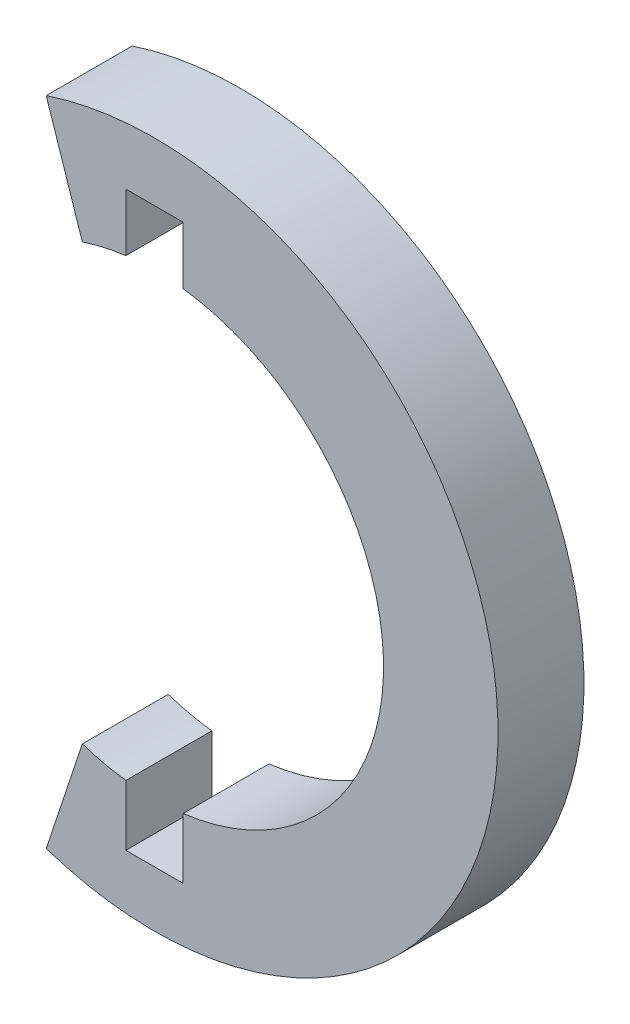
ISO-10303-21;
HEADER;
FILE_DESCRIPTION(('STEP AP214'),'2;1');
FILE_NAME('part.step','',(''),(''),'','','');
FILE_SCHEMA(('AUTOMOTIVE_DESIGN { 1 0 10303 214 1 1 1 1 }'));
ENDSEC;
DATA;
#1=APPLICATION_CONTEXT('core data for automotive mechanical design processes');
#2=APPLICATION_PROTOCOL_DEFINITION('international standard','automotive_design',2000,#1);
#3=PRODUCT_CONTEXT('',#1,'mechanical');
#4=PRODUCT('Part','Part','',(#3));
#5=PRODUCT_RELATED_PRODUCT_CATEGORY('part','',(#4));
#6=PRODUCT_DEFINITION_FORMATION('','',#4);
#7=PRODUCT_DEFINITION_CONTEXT('part definition',#1,'design');
#8=PRODUCT_DEFINITION('design','',#6,#7);
#9=PRODUCT_DEFINITION_SHAPE('','',#8);
#10=(LENGTH_UNIT() NAMED_UNIT(*) SI_UNIT(.MILLI.,.METRE.));
#11=(NAMED_UNIT(*) PLANE_ANGLE_UNIT() SI_UNIT($,.RADIAN.));
#12=(NAMED_UNIT(*) SI_UNIT($,.STERADIAN.) SOLID_ANGLE_UNIT());
#13=UNCERTAINTY_MEASURE_WITH_UNIT(LENGTH_MEASURE(1.E-05),#10,'distance_accuracy_value','');
#14=(GEOMETRIC_REPRESENTATION_CONTEXT(3) GLOBAL_UNCERTAINTY_ASSIGNED_CONTEXT((#13)) GLOBAL_UNIT_ASSIGNED_CONTEXT((#10,
#11,#12)) REPRESENTATION_CONTEXT('',''));
#15=CARTESIAN_POINT('',(0.,0.,0.));
#16=DIRECTION('',(0.,0.,1.));
#17=DIRECTION('',(1.,0.,0.));
#18=AXIS2_PLACEMENT_3D('',#15,#16,#17);
#19=CARTESIAN_POINT('',(0.,0.,3.));
#20=DIRECTION('',(0.,0.,-1.));
#21=DIRECTION('',(-1.,0.,0.));
#22=AXIS2_PLACEMENT_3D('',#19,#20,#21);
#23=CYLINDRICAL_SURFACE('',#22,8.);
#24=CARTESIAN_POINT('',(0.,0.,0.));
#25=DIRECTION('',(0.,0.,-1.));
#26=DIRECTION('',(1.,0.,0.));
#27=AXIS2_PLACEMENT_3D('',#24,#25,#26);
#28=CIRCLE('',#27,8.);
#29=CARTESIAN_POINT('',(1.,7.93725393319377,0.));
#30=VERTEX_POINT('',#29);
#31=CARTESIAN_POINT('',(1.,-7.93725393319377,0.));
#32=VERTEX_POINT('',#31);
#33=EDGE_CURVE('E157',#30,#32,#28,.T.);
#34=ORIENTED_EDGE('',*,*,#33,.T.);
#35=DIRECTION('',(0.,0.,-1.));
#36=VECTOR('',#35,1.);
#37=CARTESIAN_POINT('',(1.,-7.93725393319377,3.));
#38=LINE('',#37,#36);
#39=CARTESIAN_POINT('',(1.,-7.93725393319377,3.));
#40=VERTEX_POINT('',#39);
#41=EDGE_CURVE('E41',#40,#32,#38,.T.);
#42=ORIENTED_EDGE('',*,*,#41,.F.);
#43=CARTESIAN_POINT('',(0.,0.,3.));
#44=DIRECTION('',(0.,0.,-1.));
#45=DIRECTION('',(1.,0.,0.));
#46=AXIS2_PLACEMENT_3D('',#43,#44,#45);
#47=CIRCLE('',#46,8.);
#48=CARTESIAN_POINT('',(1.,7.93725393319377,3.));
#49=VERTEX_POINT('',#48);
#50=EDGE_CURVE('E104',#49,#40,#47,.T.);
#51=ORIENTED_EDGE('',*,*,#50,.F.);
#52=DIRECTION('',(0.,0.,-1.));
#53=VECTOR('',#52,1.);
#54=CARTESIAN_POINT('',(1.,7.93725393319377,3.));
#55=LINE('',#54,#53);
#56=EDGE_CURVE('E11',#49,#30,#55,.T.);
#57=ORIENTED_EDGE('',*,*,#56,.T.);
#58=EDGE_LOOP('',(#34,#42,#51,#57));
#59=FACE_BOUND('',#58,.T.);
#60=ADVANCED_FACE('F33',(#59),#23,.F.);
#61=CARTESIAN_POINT('',(1.,-8.94427190999916,3.));
#62=DIRECTION('',(1.,0.,0.));
#63=DIRECTION('',(0.,1.,0.));
#64=AXIS2_PLACEMENT_3D('',#61,#62,#63);
#65=PLANE('',#64);
#66=DIRECTION('',(0.,-1.,0.));
#67=VECTOR('',#66,1.);
#68=CARTESIAN_POINT('',(1.,-8.94427190999916,0.));
#69=LINE('',#68,#67);
#70=CARTESIAN_POINT('',(0.999999999999999,-10.0501256289338,0.));
#71=VERTEX_POINT('',#70);
#72=EDGE_CURVE('E160',#32,#71,#69,.T.);
#73=ORIENTED_EDGE('',*,*,#72,.T.);
#74=DIRECTION('',(0.,0.,-1.));
#75=VECTOR('',#74,1.);
#76=CARTESIAN_POINT('',(0.999999999999999,-10.0501256289338,3.));
#77=LINE('',#76,#75);
#78=CARTESIAN_POINT('',(0.999999999999999,-10.0501256289338,3.));
#79=VERTEX_POINT('',#78);
#80=EDGE_CURVE('E198',#79,#71,#77,.T.);
#81=ORIENTED_EDGE('',*,*,#80,.F.);
#82=DIRECTION('',(0.,-1.,0.));
#83=VECTOR('',#82,1.);
#84=CARTESIAN_POINT('',(1.,-8.94427190999916,3.));
#85=LINE('',#84,#83);
#86=EDGE_CURVE('E205',#40,#79,#85,.T.);
#87=ORIENTED_EDGE('',*,*,#86,.F.);
#88=ORIENTED_EDGE('',*,*,#41,.T.);
#89=EDGE_LOOP('',(#73,#81,#87,#88));
#90=FACE_BOUND('',#89,.T.);
#91=ADVANCED_FACE('F203',(#90),#65,.F.);
#92=CARTESIAN_POINT('',(0.999999999999999,-10.0501256289338,3.));
#93=DIRECTION('',(0.,-1.,0.));
#94=DIRECTION('',(0.,0.,-1.));
#95=AXIS2_PLACEMENT_3D('',#92,#93,#94);
#96=PLANE('',#95);
#97=DIRECTION('',(-1.,0.,0.));
#98=VECTOR('',#97,1.);
#99=CARTESIAN_POINT('',(0.999999999999999,-10.0501256289338,0.));
#100=LINE('',#99,#98);
#101=CARTESIAN_POINT('',(-0.999999999999999,-10.0501256289338,0.));
#102=VERTEX_POINT('',#101);
#103=EDGE_CURVE('E162',#71,#102,#100,.T.);
#104=ORIENTED_EDGE('',*,*,#103,.T.);
#105=DIRECTION('',(0.,0.,-1.));
#106=VECTOR('',#105,1.);
#107=CARTESIAN_POINT('',(-0.999999999999999,-10.0501256289338,3.));
#108=LINE('',#107,#106);
#109=CARTESIAN_POINT('',(-0.999999999999999,-10.0501256289338,3.));
#110=VERTEX_POINT('',#109);
#111=EDGE_CURVE('E195',#110,#102,#108,.T.);
#112=ORIENTED_EDGE('',*,*,#111,.F.);
#113=DIRECTION('',(-1.,0.,0.));
#114=VECTOR('',#113,1.);
#115=CARTESIAN_POINT('',(0.999999999999999,-10.0501256289338,3.));
#116=LINE('',#115,#114);
#117=EDGE_CURVE('E223',#79,#110,#116,.T.);
#118=ORIENTED_EDGE('',*,*,#117,.F.);
#119=ORIENTED_EDGE('',*,*,#80,.T.);
#120=EDGE_LOOP('',(#104,#112,#118,#119));
#121=FACE_BOUND('',#120,.T.);
#122=ADVANCED_FACE('F214',(#121),#96,.F.);
#123=CARTESIAN_POINT('',(-1.,-8.94427190999916,3.));
#124=DIRECTION('',(-1.,0.,0.));
#125=DIRECTION('',(0.,0.,1.));
#126=AXIS2_PLACEMENT_3D('',#123,#124,#125);
#127=PLANE('',#126);
#128=DIRECTION('',(0.,1.,0.));
#129=VECTOR('',#128,1.);
#130=CARTESIAN_POINT('',(-1.,-8.94427190999916,0.));
#131=LINE('',#130,#129);
#132=CARTESIAN_POINT('',(-1.,-7.93725393319377,0.));
#133=VERTEX_POINT('',#132);
#134=EDGE_CURVE('E165',#102,#133,#131,.T.);
#135=ORIENTED_EDGE('',*,*,#134,.T.);
#136=DIRECTION('',(0.,0.,-1.));
#137=VECTOR('',#136,1.);
#138=CARTESIAN_POINT('',(-1.,-7.93725393319377,3.));
#139=LINE('',#138,#137);
#140=CARTESIAN_POINT('',(-1.,-7.93725393319377,3.));
#141=VERTEX_POINT('',#140);
#142=EDGE_CURVE('E192',#141,#133,#139,.T.);
#143=ORIENTED_EDGE('',*,*,#142,.F.);
#144=DIRECTION('',(0.,1.,0.));
#145=VECTOR('',#144,1.);
#146=CARTESIAN_POINT('',(-1.,-8.94427190999916,3.));
#147=LINE('',#146,#145);
#148=EDGE_CURVE('E220',#110,#141,#147,.T.);
#149=ORIENTED_EDGE('',*,*,#148,.F.);
#150=ORIENTED_EDGE('',*,*,#111,.T.);
#151=EDGE_LOOP('',(#135,#143,#149,#150));
#152=FACE_BOUND('',#151,.T.);
#153=ADVANCED_FACE('F218',(#152),#127,.F.);
#154=CARTESIAN_POINT('',(0.,0.,3.));
#155=DIRECTION('',(0.,0.,-1.));
#156=DIRECTION('',(-1.,0.,0.));
#157=AXIS2_PLACEMENT_3D('',#154,#155,#156);
#158=CYLINDRICAL_SURFACE('',#157,8.);
#159=CARTESIAN_POINT('',(0.,0.,0.));
#160=DIRECTION('',(0.,0.,-1.));
#161=DIRECTION('',(1.,0.,0.));
#162=AXIS2_PLACEMENT_3D('',#159,#160,#161);
#163=CIRCLE('',#162,8.);
#164=CARTESIAN_POINT('',(-2.52114496226176,-7.59235326359767,0.));
#165=VERTEX_POINT('',#164);
#166=EDGE_CURVE('E167',#133,#165,#163,.T.);
#167=ORIENTED_EDGE('',*,*,#166,.T.);
#168=DIRECTION('',(0.,0.,-1.));
#169=VECTOR('',#168,1.);
#170=CARTESIAN_POINT('',(-2.52114496226176,-7.59235326359767,3.));
#171=LINE('',#170,#169);
#172=CARTESIAN_POINT('',(-2.52114496226176,-7.59235326359767,3.));
#173=VERTEX_POINT('',#172);
#174=EDGE_CURVE('E189',#173,#165,#171,.T.);
#175=ORIENTED_EDGE('',*,*,#174,.F.);
#176=CARTESIAN_POINT('',(0.,0.,3.));
#177=DIRECTION('',(0.,0.,-1.));
#178=DIRECTION('',(1.,0.,0.));
#179=AXIS2_PLACEMENT_3D('',#176,#177,#178);
#180=CIRCLE('',#179,8.);
#181=EDGE_CURVE('E222',#141,#173,#180,.T.);
#182=ORIENTED_EDGE('',*,*,#181,.F.);
#183=ORIENTED_EDGE('',*,*,#142,.T.);
#184=EDGE_LOOP('',(#167,#175,#182,#183));
#185=FACE_BOUND('',#184,.T.);
#186=ADVANCED_FACE('F247',(#185),#158,.F.);
#187=CARTESIAN_POINT('',(-2.52114496226176,-7.59235326359767,3.));
#188=DIRECTION('',(0.949044157949708,-0.31514312028272,0.));
#189=DIRECTION('',(0.31514312028272,0.949044157949708,0.));
#190=AXIS2_PLACEMENT_3D('',#187,#188,#189);
#191=PLANE('',#190);
#192=DIRECTION('',(-0.31514312028272,-0.949044157949708,0.));
#193=VECTOR('',#192,1.);
#194=CARTESIAN_POINT('',(-2.52114496226176,-7.59235326359767,0.));
#195=LINE('',#194,#193);
#196=CARTESIAN_POINT('',(-3.78171744339264,-11.3885298953965,0.));
#197=VERTEX_POINT('',#196);
#198=EDGE_CURVE('E169',#165,#197,#195,.T.);
#199=ORIENTED_EDGE('',*,*,#198,.T.);
#200=DIRECTION('',(0.,0.,-1.));
#201=VECTOR('',#200,1.);
#202=CARTESIAN_POINT('',(-3.78171744339264,-11.3885298953965,3.));
#203=LINE('',#202,#201);
#204=CARTESIAN_POINT('',(-3.78171744339264,-11.3885298953965,3.));
#205=VERTEX_POINT('',#204);
#206=EDGE_CURVE('E186',#205,#197,#203,.T.);
#207=ORIENTED_EDGE('',*,*,#206,.F.);
#208=DIRECTION('',(-0.31514312028272,-0.949044157949708,0.));
#209=VECTOR('',#208,1.);
#210=CARTESIAN_POINT('',(-2.52114496226176,-7.59235326359767,3.));
#211=LINE('',#210,#209);
#212=EDGE_CURVE('E225',#173,#205,#211,.T.);
#213=ORIENTED_EDGE('',*,*,#212,.F.);
#214=ORIENTED_EDGE('',*,*,#174,.T.);
#215=EDGE_LOOP('',(#199,#207,#213,#214));
#216=FACE_BOUND('',#215,.T.);
#217=ADVANCED_FACE('F244',(#216),#191,.F.);
#218=CARTESIAN_POINT('',(0.,0.,3.));
#219=DIRECTION('',(0.,0.,-1.));
#220=DIRECTION('',(-1.,0.,0.));
#221=AXIS2_PLACEMENT_3D('',#218,#219,#220);
#222=CYLINDRICAL_SURFACE('',#221,12.);
#223=CARTESIAN_POINT('',(0.,0.,0.));
#224=DIRECTION('',(0.,0.,1.));
#225=DIRECTION('',(1.,0.,0.));
#226=AXIS2_PLACEMENT_3D('',#223,#224,#225);
#227=CIRCLE('',#226,12.);
#228=CARTESIAN_POINT('',(-3.78171744339264,11.3885298953965,0.));
#229=VERTEX_POINT('',#228);
#230=EDGE_CURVE('E171',#197,#229,#227,.T.);
#231=ORIENTED_EDGE('',*,*,#230,.T.);
#232=DIRECTION('',(0.,0.,-1.));
#233=VECTOR('',#232,1.);
#234=CARTESIAN_POINT('',(-3.78171744339264,11.3885298953965,3.));
#235=LINE('',#234,#233);
#236=CARTESIAN_POINT('',(-3.78171744339264,11.3885298953965,3.));
#237=VERTEX_POINT('',#236);
#238=EDGE_CURVE('E183',#237,#229,#235,.T.);
#239=ORIENTED_EDGE('',*,*,#238,.F.);
#240=CARTESIAN_POINT('',(0.,0.,3.));
#241=DIRECTION('',(0.,0.,1.));
#242=DIRECTION('',(1.,0.,0.));
#243=AXIS2_PLACEMENT_3D('',#240,#241,#242);
#244=CIRCLE('',#243,12.);
#245=EDGE_CURVE('E231',#205,#237,#244,.T.);
#246=ORIENTED_EDGE('',*,*,#245,.F.);
#247=ORIENTED_EDGE('',*,*,#206,.T.);
#248=EDGE_LOOP('',(#231,#239,#246,#247));
#249=FACE_BOUND('',#248,.T.);
#250=ADVANCED_FACE('F237',(#249),#222,.T.);
#251=CARTESIAN_POINT('',(-3.78171744339264,11.3885298953965,3.));
#252=DIRECTION('',(0.949044157949708,0.31514312028272,0.));
#253=DIRECTION('',(-0.31514312028272,0.949044157949708,0.));
#254=AXIS2_PLACEMENT_3D('',#251,#252,#253);
#255=PLANE('',#254);
#256=DIRECTION('',(0.31514312028272,-0.949044157949708,0.));
#257=VECTOR('',#256,1.);
#258=CARTESIAN_POINT('',(-3.78171744339264,11.3885298953965,0.));
#259=LINE('',#258,#257);
#260=CARTESIAN_POINT('',(-2.52114496226176,7.59235326359767,0.));
#261=VERTEX_POINT('',#260);
#262=EDGE_CURVE('E173',#229,#261,#259,.T.);
#263=ORIENTED_EDGE('',*,*,#262,.T.);
#264=DIRECTION('',(0.,0.,-1.));
#265=VECTOR('',#264,1.);
#266=CARTESIAN_POINT('',(-2.52114496226176,7.59235326359767,3.));
#267=LINE('',#266,#265);
#268=CARTESIAN_POINT('',(-2.52114496226176,7.59235326359767,3.));
#269=VERTEX_POINT('',#268);
#270=EDGE_CURVE('E146',#269,#261,#267,.T.);
#271=ORIENTED_EDGE('',*,*,#270,.F.);
#272=DIRECTION('',(0.31514312028272,-0.949044157949708,0.));
#273=VECTOR('',#272,1.);
#274=CARTESIAN_POINT('',(-3.78171744339264,11.3885298953965,3.));
#275=LINE('',#274,#273);
#276=EDGE_CURVE('E136',#237,#269,#275,.T.);
#277=ORIENTED_EDGE('',*,*,#276,.F.);
#278=ORIENTED_EDGE('',*,*,#238,.T.);
#279=EDGE_LOOP('',(#263,#271,#277,#278));
#280=FACE_BOUND('',#279,.T.);
#281=ADVANCED_FACE('F241',(#280),#255,.F.);
#282=CARTESIAN_POINT('',(0.,0.,3.));
#283=DIRECTION('',(0.,0.,-1.));
#284=DIRECTION('',(-1.,0.,0.));
#285=AXIS2_PLACEMENT_3D('',#282,#283,#284);
#286=CYLINDRICAL_SURFACE('',#285,8.);
#287=CARTESIAN_POINT('',(0.,0.,0.));
#288=DIRECTION('',(0.,0.,-1.));
#289=DIRECTION('',(1.,0.,0.));
#290=AXIS2_PLACEMENT_3D('',#287,#288,#289);
#291=CIRCLE('',#290,8.);
#292=CARTESIAN_POINT('',(-1.,7.93725393319377,0.));
#293=VERTEX_POINT('',#292);
#294=EDGE_CURVE('E145',#261,#293,#291,.T.);
#295=ORIENTED_EDGE('',*,*,#294,.T.);
#296=DIRECTION('',(0.,0.,-1.));
#297=VECTOR('',#296,1.);
#298=CARTESIAN_POINT('',(-1.,7.93725393319377,3.));
#299=LINE('',#298,#297);
#300=CARTESIAN_POINT('',(-1.,7.93725393319377,3.));
#301=VERTEX_POINT('',#300);
#302=EDGE_CURVE('E142',#301,#293,#299,.T.);
#303=ORIENTED_EDGE('',*,*,#302,.F.);
#304=CARTESIAN_POINT('',(0.,0.,3.));
#305=DIRECTION('',(0.,0.,-1.));
#306=DIRECTION('',(1.,0.,0.));
#307=AXIS2_PLACEMENT_3D('',#304,#305,#306);
#308=CIRCLE('',#307,8.);
#309=EDGE_CURVE('E130',#269,#301,#308,.T.);
#310=ORIENTED_EDGE('',*,*,#309,.F.);
#311=ORIENTED_EDGE('',*,*,#270,.T.);
#312=EDGE_LOOP('',(#295,#303,#310,#311));
#313=FACE_BOUND('',#312,.T.);
#314=ADVANCED_FACE('F143',(#313),#286,.F.);
#315=CARTESIAN_POINT('',(-1.,8.94427190999916,3.));
#316=DIRECTION('',(-1.,0.,0.));
#317=DIRECTION('',(0.,-1.,0.));
#318=AXIS2_PLACEMENT_3D('',#315,#316,#317);
#319=PLANE('',#318);
#320=DIRECTION('',(0.,1.,0.));
#321=VECTOR('',#320,1.);
#322=CARTESIAN_POINT('',(-1.,8.94427190999916,0.));
#323=LINE('',#322,#321);
#324=CARTESIAN_POINT('',(-1.,9.9498743710662,0.));
#325=VERTEX_POINT('',#324);
#326=EDGE_CURVE('E90',#293,#325,#323,.T.);
#327=ORIENTED_EDGE('',*,*,#326,.T.);
#328=DIRECTION('',(0.,0.,-1.));
#329=VECTOR('',#328,1.);
#330=CARTESIAN_POINT('',(-1.,9.9498743710662,3.));
#331=LINE('',#330,#329);
#332=CARTESIAN_POINT('',(-1.,9.9498743710662,3.));
#333=VERTEX_POINT('',#332);
#334=EDGE_CURVE('E147',#333,#325,#331,.T.);
#335=ORIENTED_EDGE('',*,*,#334,.F.);
#336=DIRECTION('',(0.,1.,0.));
#337=VECTOR('',#336,1.);
#338=CARTESIAN_POINT('',(-1.,8.94427190999916,3.));
#339=LINE('',#338,#337);
#340=EDGE_CURVE('E134',#301,#333,#339,.T.);
#341=ORIENTED_EDGE('',*,*,#340,.F.);
#342=ORIENTED_EDGE('',*,*,#302,.T.);
#343=EDGE_LOOP('',(#327,#335,#341,#342));
#344=FACE_BOUND('',#343,.T.);
#345=ADVANCED_FACE('F149',(#344),#319,.F.);
#346=CARTESIAN_POINT('',(1.,9.9498743710662,3.));
#347=DIRECTION('',(0.,1.,0.));
#348=DIRECTION('',(0.,0.,1.));
#349=AXIS2_PLACEMENT_3D('',#346,#347,#348);
#350=PLANE('',#349);
#351=DIRECTION('',(1.,0.,0.));
#352=VECTOR('',#351,1.);
#353=CARTESIAN_POINT('',(1.,9.9498743710662,0.));
#354=LINE('',#353,#352);
#355=CARTESIAN_POINT('',(1.,9.9498743710662,0.));
#356=VERTEX_POINT('',#355);
#357=EDGE_CURVE('E97',#325,#356,#354,.T.);
#358=ORIENTED_EDGE('',*,*,#357,.T.);
#359=DIRECTION('',(0.,0.,-1.));
#360=VECTOR('',#359,1.);
#361=CARTESIAN_POINT('',(1.,9.9498743710662,3.));
#362=LINE('',#361,#360);
#363=CARTESIAN_POINT('',(1.,9.9498743710662,3.));
#364=VERTEX_POINT('',#363);
#365=EDGE_CURVE('E153',#364,#356,#362,.T.);
#366=ORIENTED_EDGE('',*,*,#365,.F.);
#367=DIRECTION('',(1.,0.,0.));
#368=VECTOR('',#367,1.);
#369=CARTESIAN_POINT('',(1.,9.9498743710662,3.));
#370=LINE('',#369,#368);
#371=EDGE_CURVE('E151',#333,#364,#370,.T.);
#372=ORIENTED_EDGE('',*,*,#371,.F.);
#373=ORIENTED_EDGE('',*,*,#334,.T.);
#374=EDGE_LOOP('',(#358,#366,#372,#373));
#375=FACE_BOUND('',#374,.T.);
#376=ADVANCED_FACE('F315',(#375),#350,.F.);
#377=CARTESIAN_POINT('',(1.,8.94427190999916,3.));
#378=DIRECTION('',(1.,0.,0.));
#379=DIRECTION('',(0.,1.,0.));
#380=AXIS2_PLACEMENT_3D('',#377,#378,#379);
#381=PLANE('',#380);
#382=DIRECTION('',(0.,-1.,0.));
#383=VECTOR('',#382,1.);
#384=CARTESIAN_POINT('',(1.,8.94427190999916,0.));
#385=LINE('',#384,#383);
#386=EDGE_CURVE('E178',#356,#30,#385,.T.);
#387=ORIENTED_EDGE('',*,*,#386,.T.);
#388=ORIENTED_EDGE('',*,*,#56,.F.);
#389=DIRECTION('',(0.,-1.,0.));
#390=VECTOR('',#389,1.);
#391=CARTESIAN_POINT('',(1.,8.94427190999916,3.));
#392=LINE('',#391,#390);
#393=EDGE_CURVE('E49',#364,#49,#392,.T.);
#394=ORIENTED_EDGE('',*,*,#393,.F.);
#395=ORIENTED_EDGE('',*,*,#365,.T.);
#396=EDGE_LOOP('',(#387,#388,#394,#395));
#397=FACE_BOUND('',#396,.T.);
#398=ADVANCED_FACE('F324',(#397),#381,.F.);
#399=CARTESIAN_POINT('',(0.,0.,3.));
#400=DIRECTION('',(0.,0.,1.));
#401=DIRECTION('',(1.,0.,0.));
#402=AXIS2_PLACEMENT_3D('',#399,#400,#401);
#403=PLANE('',#402);
#404=ORIENTED_EDGE('',*,*,#393,.T.);
#405=ORIENTED_EDGE('',*,*,#50,.T.);
#406=ORIENTED_EDGE('',*,*,#86,.T.);
#407=ORIENTED_EDGE('',*,*,#117,.T.);
#408=ORIENTED_EDGE('',*,*,#148,.T.);
#409=ORIENTED_EDGE('',*,*,#181,.T.);
#410=ORIENTED_EDGE('',*,*,#212,.T.);
#411=ORIENTED_EDGE('',*,*,#245,.T.);
#412=ORIENTED_EDGE('',*,*,#276,.T.);
#413=ORIENTED_EDGE('',*,*,#309,.T.);
#414=ORIENTED_EDGE('',*,*,#340,.T.);
#415=ORIENTED_EDGE('',*,*,#371,.T.);
#416=EDGE_LOOP('',(#404,#405,#406,#407,#408,#409,#410,#411,#412,#413,#414,#415));
#417=FACE_BOUND('',#416,.T.);
#418=ADVANCED_FACE('F132',(#417),#403,.T.);
#419=CARTESIAN_POINT('',(0.,0.,0.));
#420=DIRECTION('',(0.,0.,1.));
#421=DIRECTION('',(1.,0.,0.));
#422=AXIS2_PLACEMENT_3D('',#419,#420,#421);
#423=PLANE('',#422);
#424=ORIENTED_EDGE('',*,*,#33,.F.);
#425=ORIENTED_EDGE('',*,*,#386,.F.);
#426=ORIENTED_EDGE('',*,*,#357,.F.);
#427=ORIENTED_EDGE('',*,*,#326,.F.);
#428=ORIENTED_EDGE('',*,*,#294,.F.);
#429=ORIENTED_EDGE('',*,*,#262,.F.);
#430=ORIENTED_EDGE('',*,*,#230,.F.);
#431=ORIENTED_EDGE('',*,*,#198,.F.);
#432=ORIENTED_EDGE('',*,*,#166,.F.);
#433=ORIENTED_EDGE('',*,*,#134,.F.);
#434=ORIENTED_EDGE('',*,*,#103,.F.);
#435=ORIENTED_EDGE('',*,*,#72,.F.);
#436=EDGE_LOOP('',(#424,#425,#426,#427,#428,#429,#430,#431,#432,#433,#434,#435));
#437=FACE_BOUND('',#436,.T.);
#438=ADVANCED_FACE('F209',(#437),#423,.F.);
#439=CLOSED_SHELL('',(#60,#91,#122,#153,#186,#217,#250,#281,#314,#345,#376,#398,#418,#438));
#440=MANIFOLD_SOLID_BREP('B2',#439);
#441=ADVANCED_BREP_SHAPE_REPRESENTATION('',(#18,#440),#14);
#442=SHAPE_DEFINITION_REPRESENTATION(#9,#441);
ENDSEC;
END-ISO-10303-21;
